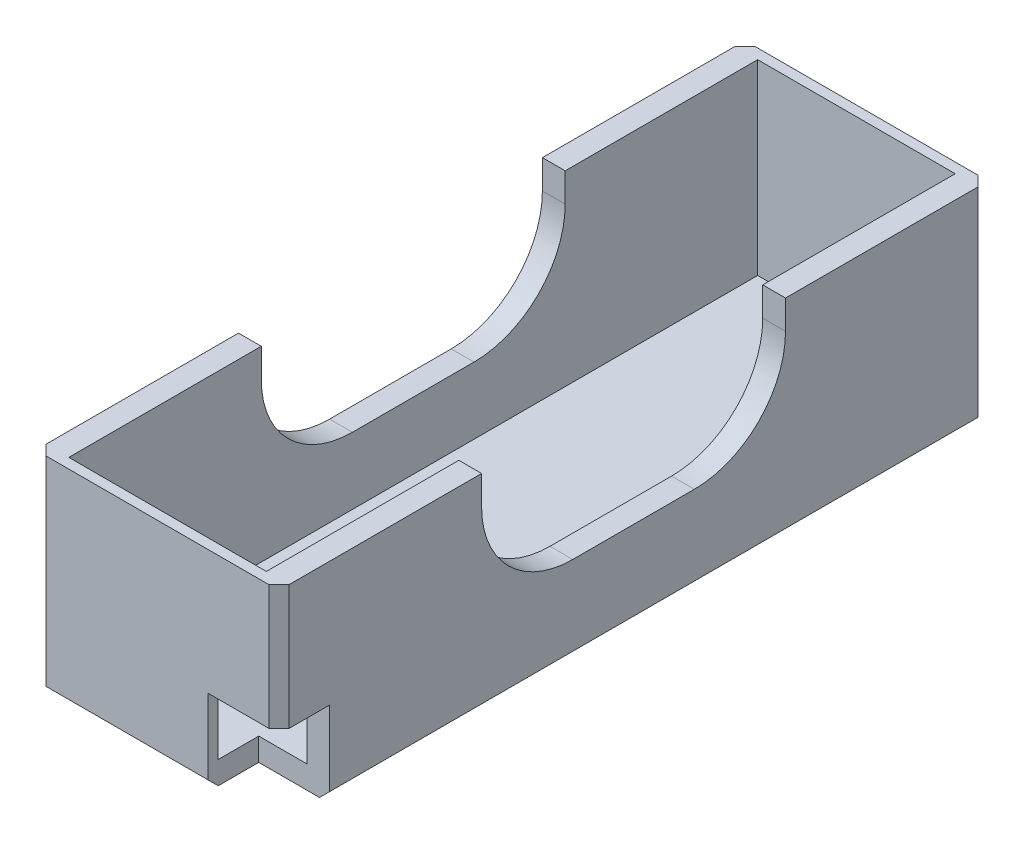
ISO-10303-21;
HEADER;
FILE_DESCRIPTION(('STEP AP214'),'2;1');
FILE_NAME('part.step','',(''),(''),'','','');
FILE_SCHEMA(('AUTOMOTIVE_DESIGN { 1 0 10303 214 1 1 1 1 }'));
ENDSEC;
DATA;
#1=APPLICATION_CONTEXT('core data for automotive mechanical design processes');
#2=APPLICATION_PROTOCOL_DEFINITION('international standard','automotive_design',2000,#1);
#3=PRODUCT_CONTEXT('',#1,'mechanical');
#4=PRODUCT('Part','Part','',(#3));
#5=PRODUCT_RELATED_PRODUCT_CATEGORY('part','',(#4));
#6=PRODUCT_DEFINITION_FORMATION('','',#4);
#7=PRODUCT_DEFINITION_CONTEXT('part definition',#1,'design');
#8=PRODUCT_DEFINITION('design','',#6,#7);
#9=PRODUCT_DEFINITION_SHAPE('','',#8);
#10=(LENGTH_UNIT() NAMED_UNIT(*) SI_UNIT(.MILLI.,.METRE.));
#11=(NAMED_UNIT(*) PLANE_ANGLE_UNIT() SI_UNIT($,.RADIAN.));
#12=(NAMED_UNIT(*) SI_UNIT($,.STERADIAN.) SOLID_ANGLE_UNIT());
#13=UNCERTAINTY_MEASURE_WITH_UNIT(LENGTH_MEASURE(1.E-05),#10,'distance_accuracy_value','');
#14=(GEOMETRIC_REPRESENTATION_CONTEXT(3) GLOBAL_UNCERTAINTY_ASSIGNED_CONTEXT((#13)) GLOBAL_UNIT_ASSIGNED_CONTEXT((#10,
#11,#12)) REPRESENTATION_CONTEXT('',''));
#15=CARTESIAN_POINT('',(0.,0.,0.));
#16=DIRECTION('',(0.,0.,1.));
#17=DIRECTION('',(1.,0.,0.));
#18=AXIS2_PLACEMENT_3D('',#15,#16,#17);
#19=CARTESIAN_POINT('',(0.,20.7,0.));
#20=DIRECTION('',(0.,1.,0.));
#21=DIRECTION('',(0.,0.,1.));
#22=AXIS2_PLACEMENT_3D('',#19,#20,#21);
#23=PLANE('',#22);
#24=DIRECTION('',(0.,0.,-1.));
#25=VECTOR('',#24,1.);
#26=CARTESIAN_POINT('',(12.,20.7,35.));
#27=LINE('',#26,#25);
#28=CARTESIAN_POINT('',(12.,20.7,-15.));
#29=VERTEX_POINT('',#28);
#30=CARTESIAN_POINT('',(12.,20.7,-34.));
#31=VERTEX_POINT('',#30);
#32=EDGE_CURVE('E354',#29,#31,#27,.T.);
#33=ORIENTED_EDGE('',*,*,#32,.T.);
#34=DIRECTION('',(0.707106781186545,0.,0.70710678118655));
#35=VECTOR('',#34,1.);
#36=CARTESIAN_POINT('',(23.,20.7,-22.9999999999999));
#37=LINE('',#36,#35);
#38=CARTESIAN_POINT('',(11.,20.7,-35.));
#39=VERTEX_POINT('',#38);
#40=EDGE_CURVE('E446',#31,#39,#37,.F.);
#41=ORIENTED_EDGE('',*,*,#40,.T.);
#42=DIRECTION('',(-1.,0.,0.));
#43=VECTOR('',#42,1.);
#44=CARTESIAN_POINT('',(12.,20.7,-35.));
#45=LINE('',#44,#43);
#46=CARTESIAN_POINT('',(-11.,20.7,-35.));
#47=VERTEX_POINT('',#46);
#48=EDGE_CURVE('E357',#39,#47,#45,.T.);
#49=ORIENTED_EDGE('',*,*,#48,.T.);
#50=DIRECTION('',(0.707106781186545,0.,-0.70710678118655));
#51=VECTOR('',#50,1.);
#52=CARTESIAN_POINT('',(-23.,20.7,-22.9999999999999));
#53=LINE('',#52,#51);
#54=CARTESIAN_POINT('',(-12.,20.7,-34.));
#55=VERTEX_POINT('',#54);
#56=EDGE_CURVE('E444',#47,#55,#53,.F.);
#57=ORIENTED_EDGE('',*,*,#56,.T.);
#58=DIRECTION('',(0.,0.,1.));
#59=VECTOR('',#58,1.);
#60=CARTESIAN_POINT('',(-12.,20.7,35.));
#61=LINE('',#60,#59);
#62=CARTESIAN_POINT('',(-12.,20.7,-15.));
#63=VERTEX_POINT('',#62);
#64=EDGE_CURVE('E349',#55,#63,#61,.T.);
#65=ORIENTED_EDGE('',*,*,#64,.T.);
#66=DIRECTION('',(-1.,0.,0.));
#67=VECTOR('',#66,1.);
#68=CARTESIAN_POINT('',(12.,20.7,-15.));
#69=LINE('',#68,#67);
#70=CARTESIAN_POINT('',(-9.75,20.7,-15.));
#71=VERTEX_POINT('',#70);
#72=EDGE_CURVE('E295',#71,#63,#69,.T.);
#73=ORIENTED_EDGE('',*,*,#72,.F.);
#74=DIRECTION('',(0.,0.,1.));
#75=VECTOR('',#74,1.);
#76=CARTESIAN_POINT('',(-9.75,20.7,34.));
#77=LINE('',#76,#75);
#78=CARTESIAN_POINT('',(-9.75,20.7,-34.));
#79=VERTEX_POINT('',#78);
#80=EDGE_CURVE('E325',#79,#71,#77,.T.);
#81=ORIENTED_EDGE('',*,*,#80,.F.);
#82=DIRECTION('',(-1.,0.,0.));
#83=VECTOR('',#82,1.);
#84=CARTESIAN_POINT('',(9.75,20.7,-34.));
#85=LINE('',#84,#83);
#86=CARTESIAN_POINT('',(9.75,20.7,-34.));
#87=VERTEX_POINT('',#86);
#88=EDGE_CURVE('E335',#87,#79,#85,.T.);
#89=ORIENTED_EDGE('',*,*,#88,.F.);
#90=DIRECTION('',(0.,0.,-1.));
#91=VECTOR('',#90,1.);
#92=CARTESIAN_POINT('',(9.75,20.7,34.));
#93=LINE('',#92,#91);
#94=CARTESIAN_POINT('',(9.75,20.7,-15.));
#95=VERTEX_POINT('',#94);
#96=EDGE_CURVE('E331',#95,#87,#93,.T.);
#97=ORIENTED_EDGE('',*,*,#96,.F.);
#98=EDGE_CURVE('E291',#29,#95,#69,.T.);
#99=ORIENTED_EDGE('',*,*,#98,.F.);
#100=EDGE_LOOP('',(#33,#41,#49,#57,#65,#73,#81,#89,#97,#99));
#101=FACE_BOUND('',#100,.T.);
#102=ADVANCED_FACE('F35',(#101),#23,.T.);
#103=CARTESIAN_POINT('',(-12.,20.7,35.));
#104=DIRECTION('',(1.,0.,0.));
#105=DIRECTION('',(0.,0.,-1.));
#106=AXIS2_PLACEMENT_3D('',#103,#104,#105);
#107=PLANE('',#106);
#108=ORIENTED_EDGE('',*,*,#64,.F.);
#109=DIRECTION('',(0.,-1.,0.));
#110=VECTOR('',#109,1.);
#111=CARTESIAN_POINT('',(-12.,20.7,-34.));
#112=LINE('',#111,#110);
#113=CARTESIAN_POINT('',(-12.,0.999999999999994,-34.));
#114=VERTEX_POINT('',#113);
#115=EDGE_CURVE('E44',#55,#114,#112,.T.);
#116=ORIENTED_EDGE('',*,*,#115,.T.);
#117=DIRECTION('',(0.,0.,1.));
#118=VECTOR('',#117,1.);
#119=CARTESIAN_POINT('',(-12.,0.999999999999994,35.));
#120=LINE('',#119,#118);
#121=CARTESIAN_POINT('',(-12.,0.999999999999994,34.));
#122=VERTEX_POINT('',#121);
#123=EDGE_CURVE('E55',#114,#122,#120,.T.);
#124=ORIENTED_EDGE('',*,*,#123,.T.);
#125=DIRECTION('',(0.,1.,0.));
#126=VECTOR('',#125,1.);
#127=CARTESIAN_POINT('',(-12.,20.7,34.));
#128=LINE('',#127,#126);
#129=CARTESIAN_POINT('',(-12.,20.7,34.));
#130=VERTEX_POINT('',#129);
#131=EDGE_CURVE('E448',#122,#130,#128,.T.);
#132=ORIENTED_EDGE('',*,*,#131,.T.);
#133=CARTESIAN_POINT('',(-12.,20.7,15.));
#134=VERTEX_POINT('',#133);
#135=EDGE_CURVE('E348',#134,#130,#61,.T.);
#136=ORIENTED_EDGE('',*,*,#135,.F.);
#137=DIRECTION('',(0.,-1.,0.));
#138=VECTOR('',#137,1.);
#139=CARTESIAN_POINT('',(-12.,20.7,15.));
#140=LINE('',#139,#138);
#141=CARTESIAN_POINT('',(-12.,17.85,15.));
#142=VERTEX_POINT('',#141);
#143=EDGE_CURVE('E306',#134,#142,#140,.T.);
#144=ORIENTED_EDGE('',*,*,#143,.T.);
#145=CARTESIAN_POINT('',(-12.,17.85,6.));
#146=DIRECTION('',(1.,0.,0.));
#147=DIRECTION('',(0.,0.,-1.));
#148=AXIS2_PLACEMENT_3D('',#145,#146,#147);
#149=CIRCLE('',#148,9.);
#150=CARTESIAN_POINT('',(-12.,8.85,6.00000000000001));
#151=VERTEX_POINT('',#150);
#152=EDGE_CURVE('E388',#142,#151,#149,.T.);
#153=ORIENTED_EDGE('',*,*,#152,.T.);
#154=DIRECTION('',(0.,0.,-1.));
#155=VECTOR('',#154,1.);
#156=CARTESIAN_POINT('',(-12.,8.85,35.));
#157=LINE('',#156,#155);
#158=CARTESIAN_POINT('',(-12.,8.85,-6.00000000000001));
#159=VERTEX_POINT('',#158);
#160=EDGE_CURVE('E301',#151,#159,#157,.T.);
#161=ORIENTED_EDGE('',*,*,#160,.T.);
#162=CARTESIAN_POINT('',(-12.,17.85,-6.));
#163=DIRECTION('',(1.,0.,0.));
#164=DIRECTION('',(0.,0.,-1.));
#165=AXIS2_PLACEMENT_3D('',#162,#163,#164);
#166=CIRCLE('',#165,9.);
#167=CARTESIAN_POINT('',(-12.,17.85,-15.));
#168=VERTEX_POINT('',#167);
#169=EDGE_CURVE('E396',#159,#168,#166,.T.);
#170=ORIENTED_EDGE('',*,*,#169,.T.);
#171=DIRECTION('',(0.,1.,0.));
#172=VECTOR('',#171,1.);
#173=CARTESIAN_POINT('',(-12.,20.7,-15.));
#174=LINE('',#173,#172);
#175=EDGE_CURVE('E312',#168,#63,#174,.T.);
#176=ORIENTED_EDGE('',*,*,#175,.T.);
#177=EDGE_LOOP('',(#108,#116,#124,#132,#136,#144,#153,#161,#170,#176));
#178=FACE_BOUND('',#177,.T.);
#179=ADVANCED_FACE('F557',(#178),#107,.F.);
#180=CARTESIAN_POINT('',(12.,20.7,35.));
#181=DIRECTION('',(0.,0.,-1.));
#182=DIRECTION('',(-1.,0.,0.));
#183=AXIS2_PLACEMENT_3D('',#180,#181,#182);
#184=PLANE('',#183);
#185=DIRECTION('',(-1.,0.,0.));
#186=VECTOR('',#185,1.);
#187=CARTESIAN_POINT('',(12.,8.41,35.));
#188=LINE('',#187,#186);
#189=CARTESIAN_POINT('',(11.,8.41,35.));
#190=VERTEX_POINT('',#189);
#191=CARTESIAN_POINT('',(5.,8.41,35.));
#192=VERTEX_POINT('',#191);
#193=EDGE_CURVE('E480',#190,#192,#188,.T.);
#194=ORIENTED_EDGE('',*,*,#193,.F.);
#195=DIRECTION('',(0.,1.,0.));
#196=VECTOR('',#195,1.);
#197=CARTESIAN_POINT('',(11.,20.7,35.));
#198=LINE('',#197,#196);
#199=CARTESIAN_POINT('',(11.,20.7,35.));
#200=VERTEX_POINT('',#199);
#201=EDGE_CURVE('E423',#190,#200,#198,.T.);
#202=ORIENTED_EDGE('',*,*,#201,.T.);
#203=DIRECTION('',(1.,0.,0.));
#204=VECTOR('',#203,1.);
#205=CARTESIAN_POINT('',(12.,20.7,35.));
#206=LINE('',#205,#204);
#207=CARTESIAN_POINT('',(-11.,20.7,35.));
#208=VERTEX_POINT('',#207);
#209=EDGE_CURVE('E351',#208,#200,#206,.T.);
#210=ORIENTED_EDGE('',*,*,#209,.F.);
#211=DIRECTION('',(0.,-1.,0.));
#212=VECTOR('',#211,1.);
#213=CARTESIAN_POINT('',(-11.,20.7,35.));
#214=LINE('',#213,#212);
#215=CARTESIAN_POINT('',(-11.,0.999999999999994,35.));
#216=VERTEX_POINT('',#215);
#217=EDGE_CURVE('E419',#208,#216,#214,.T.);
#218=ORIENTED_EDGE('',*,*,#217,.T.);
#219=DIRECTION('',(1.,0.,0.));
#220=VECTOR('',#219,1.);
#221=CARTESIAN_POINT('',(12.,0.999999999999994,35.));
#222=LINE('',#221,#220);
#223=CARTESIAN_POINT('',(5.,0.999999999999994,35.));
#224=VERTEX_POINT('',#223);
#225=EDGE_CURVE('E421',#216,#224,#222,.T.);
#226=ORIENTED_EDGE('',*,*,#225,.T.);
#227=DIRECTION('',(0.,-1.,0.));
#228=VECTOR('',#227,1.);
#229=CARTESIAN_POINT('',(5.,0.,35.));
#230=LINE('',#229,#228);
#231=EDGE_CURVE('E477',#192,#224,#230,.T.);
#232=ORIENTED_EDGE('',*,*,#231,.F.);
#233=EDGE_LOOP('',(#194,#202,#210,#218,#226,#232));
#234=FACE_BOUND('',#233,.T.);
#235=ADVANCED_FACE('F547',(#234),#184,.F.);
#236=CARTESIAN_POINT('',(12.,20.7,35.));
#237=DIRECTION('',(-1.,0.,0.));
#238=DIRECTION('',(0.,0.,1.));
#239=AXIS2_PLACEMENT_3D('',#236,#237,#238);
#240=PLANE('',#239);
#241=CARTESIAN_POINT('',(12.,20.7,34.));
#242=VERTEX_POINT('',#241);
#243=CARTESIAN_POINT('',(12.,20.7,15.));
#244=VERTEX_POINT('',#243);
#245=EDGE_CURVE('E355',#242,#244,#27,.T.);
#246=ORIENTED_EDGE('',*,*,#245,.F.);
#247=DIRECTION('',(0.,-1.,0.));
#248=VECTOR('',#247,1.);
#249=CARTESIAN_POINT('',(12.,20.7,34.));
#250=LINE('',#249,#248);
#251=CARTESIAN_POINT('',(12.,8.41,34.));
#252=VERTEX_POINT('',#251);
#253=EDGE_CURVE('E266',#242,#252,#250,.T.);
#254=ORIENTED_EDGE('',*,*,#253,.T.);
#255=DIRECTION('',(0.,0.,1.));
#256=VECTOR('',#255,1.);
#257=CARTESIAN_POINT('',(12.,8.41,30.));
#258=LINE('',#257,#256);
#259=CARTESIAN_POINT('',(12.,8.41,30.));
#260=VERTEX_POINT('',#259);
#261=EDGE_CURVE('E257',#260,#252,#258,.T.);
#262=ORIENTED_EDGE('',*,*,#261,.F.);
#263=DIRECTION('',(0.,1.,0.));
#264=VECTOR('',#263,1.);
#265=CARTESIAN_POINT('',(12.,0.,30.));
#266=LINE('',#265,#264);
#267=CARTESIAN_POINT('',(12.,0.999999999999994,30.));
#268=VERTEX_POINT('',#267);
#269=EDGE_CURVE('E240',#268,#260,#266,.T.);
#270=ORIENTED_EDGE('',*,*,#269,.F.);
#271=DIRECTION('',(0.,0.,-1.));
#272=VECTOR('',#271,1.);
#273=CARTESIAN_POINT('',(12.,0.999999999999994,35.));
#274=LINE('',#273,#272);
#275=CARTESIAN_POINT('',(12.,0.999999999999994,-34.));
#276=VERTEX_POINT('',#275);
#277=EDGE_CURVE('E414',#268,#276,#274,.T.);
#278=ORIENTED_EDGE('',*,*,#277,.T.);
#279=DIRECTION('',(0.,1.,0.));
#280=VECTOR('',#279,1.);
#281=CARTESIAN_POINT('',(12.,20.7,-34.));
#282=LINE('',#281,#280);
#283=EDGE_CURVE('E412',#276,#31,#282,.T.);
#284=ORIENTED_EDGE('',*,*,#283,.T.);
#285=ORIENTED_EDGE('',*,*,#32,.F.);
#286=DIRECTION('',(0.,-1.,0.));
#287=VECTOR('',#286,1.);
#288=CARTESIAN_POINT('',(12.,8.85,-15.));
#289=LINE('',#288,#287);
#290=CARTESIAN_POINT('',(12.,17.85,-15.));
#291=VERTEX_POINT('',#290);
#292=EDGE_CURVE('E281',#29,#291,#289,.T.);
#293=ORIENTED_EDGE('',*,*,#292,.T.);
#294=CARTESIAN_POINT('',(12.,17.85,-6.));
#295=DIRECTION('',(-1.,0.,0.));
#296=DIRECTION('',(0.,0.,1.));
#297=AXIS2_PLACEMENT_3D('',#294,#295,#296);
#298=CIRCLE('',#297,9.);
#299=CARTESIAN_POINT('',(12.,8.85,-6.));
#300=VERTEX_POINT('',#299);
#301=EDGE_CURVE('E402',#291,#300,#298,.T.);
#302=ORIENTED_EDGE('',*,*,#301,.T.);
#303=DIRECTION('',(0.,0.,1.));
#304=VECTOR('',#303,1.);
#305=CARTESIAN_POINT('',(12.,8.85,15.));
#306=LINE('',#305,#304);
#307=CARTESIAN_POINT('',(12.,8.85,6.00000000000001));
#308=VERTEX_POINT('',#307);
#309=EDGE_CURVE('E284',#300,#308,#306,.T.);
#310=ORIENTED_EDGE('',*,*,#309,.T.);
#311=CARTESIAN_POINT('',(12.,17.85,6.));
#312=DIRECTION('',(-1.,0.,0.));
#313=DIRECTION('',(0.,0.,1.));
#314=AXIS2_PLACEMENT_3D('',#311,#312,#313);
#315=CIRCLE('',#314,9.);
#316=CARTESIAN_POINT('',(12.,17.85,15.));
#317=VERTEX_POINT('',#316);
#318=EDGE_CURVE('E394',#308,#317,#315,.T.);
#319=ORIENTED_EDGE('',*,*,#318,.T.);
#320=DIRECTION('',(0.,1.,0.));
#321=VECTOR('',#320,1.);
#322=CARTESIAN_POINT('',(12.,8.85,15.));
#323=LINE('',#322,#321);
#324=EDGE_CURVE('E287',#317,#244,#323,.T.);
#325=ORIENTED_EDGE('',*,*,#324,.T.);
#326=EDGE_LOOP('',(#246,#254,#262,#270,#278,#284,#285,#293,#302,#310,#319,#325));
#327=FACE_BOUND('',#326,.T.);
#328=ADVANCED_FACE('F264',(#327),#240,.F.);
#329=CARTESIAN_POINT('',(12.,20.7,-35.));
#330=DIRECTION('',(0.,0.,1.));
#331=DIRECTION('',(1.,0.,0.));
#332=AXIS2_PLACEMENT_3D('',#329,#330,#331);
#333=PLANE('',#332);
#334=ORIENTED_EDGE('',*,*,#48,.F.);
#335=DIRECTION('',(0.,-1.,0.));
#336=VECTOR('',#335,1.);
#337=CARTESIAN_POINT('',(11.,20.7,-35.));
#338=LINE('',#337,#336);
#339=CARTESIAN_POINT('',(11.,0.999999999999994,-35.));
#340=VERTEX_POINT('',#339);
#341=EDGE_CURVE('E442',#39,#340,#338,.T.);
#342=ORIENTED_EDGE('',*,*,#341,.T.);
#343=DIRECTION('',(-1.,0.,0.));
#344=VECTOR('',#343,1.);
#345=CARTESIAN_POINT('',(12.,0.999999999999994,-35.));
#346=LINE('',#345,#344);
#347=CARTESIAN_POINT('',(-11.,0.999999999999994,-35.));
#348=VERTEX_POINT('',#347);
#349=EDGE_CURVE('E440',#340,#348,#346,.T.);
#350=ORIENTED_EDGE('',*,*,#349,.T.);
#351=DIRECTION('',(0.,1.,0.));
#352=VECTOR('',#351,1.);
#353=CARTESIAN_POINT('',(-11.,20.7,-35.));
#354=LINE('',#353,#352);
#355=EDGE_CURVE('E438',#348,#47,#354,.T.);
#356=ORIENTED_EDGE('',*,*,#355,.T.);
#357=EDGE_LOOP('',(#334,#342,#350,#356));
#358=FACE_BOUND('',#357,.T.);
#359=ADVANCED_FACE('F621',(#358),#333,.F.);
#360=ORIENTED_EDGE('',*,*,#209,.T.);
#361=DIRECTION('',(-0.707106781186552,0.,0.707106781186543));
#362=VECTOR('',#361,1.);
#363=CARTESIAN_POINT('',(22.9999999999999,20.7,23.0000000000002));
#364=LINE('',#363,#362);
#365=EDGE_CURVE('E427',#200,#242,#364,.F.);
#366=ORIENTED_EDGE('',*,*,#365,.T.);
#367=ORIENTED_EDGE('',*,*,#245,.T.);
#368=DIRECTION('',(-1.,0.,0.));
#369=VECTOR('',#368,1.);
#370=CARTESIAN_POINT('',(12.,20.7,15.));
#371=LINE('',#370,#369);
#372=CARTESIAN_POINT('',(9.75,20.7,15.));
#373=VERTEX_POINT('',#372);
#374=EDGE_CURVE('E296',#244,#373,#371,.T.);
#375=ORIENTED_EDGE('',*,*,#374,.T.);
#376=CARTESIAN_POINT('',(9.75,20.7,34.));
#377=VERTEX_POINT('',#376);
#378=EDGE_CURVE('E332',#377,#373,#93,.T.);
#379=ORIENTED_EDGE('',*,*,#378,.F.);
#380=DIRECTION('',(1.,0.,0.));
#381=VECTOR('',#380,1.);
#382=CARTESIAN_POINT('',(9.75,20.7,34.));
#383=LINE('',#382,#381);
#384=CARTESIAN_POINT('',(-9.75,20.7,34.));
#385=VERTEX_POINT('',#384);
#386=EDGE_CURVE('E328',#385,#377,#383,.T.);
#387=ORIENTED_EDGE('',*,*,#386,.F.);
#388=CARTESIAN_POINT('',(-9.75,20.7,15.));
#389=VERTEX_POINT('',#388);
#390=EDGE_CURVE('E315',#389,#385,#77,.T.);
#391=ORIENTED_EDGE('',*,*,#390,.F.);
#392=EDGE_CURVE('E290',#389,#134,#371,.T.);
#393=ORIENTED_EDGE('',*,*,#392,.T.);
#394=ORIENTED_EDGE('',*,*,#135,.T.);
#395=DIRECTION('',(-0.707106781186548,0.,-0.707106781186548));
#396=VECTOR('',#395,1.);
#397=CARTESIAN_POINT('',(-23.,20.7,23.));
#398=LINE('',#397,#396);
#399=EDGE_CURVE('E425',#130,#208,#398,.F.);
#400=ORIENTED_EDGE('',*,*,#399,.T.);
#401=EDGE_LOOP('',(#360,#366,#367,#375,#379,#387,#391,#393,#394,#400));
#402=FACE_BOUND('',#401,.T.);
#403=ADVANCED_FACE('F559',(#402),#23,.T.);
#404=CARTESIAN_POINT('',(0.,0.,0.));
#405=DIRECTION('',(0.,1.,0.));
#406=DIRECTION('',(0.,0.,1.));
#407=AXIS2_PLACEMENT_3D('',#404,#405,#406);
#408=PLANE('',#407);
#409=DIRECTION('',(1.,0.,0.));
#410=VECTOR('',#409,1.);
#411=CARTESIAN_POINT('',(0.,0.,-34.));
#412=LINE('',#411,#410);
#413=CARTESIAN_POINT('',(-11.,0.,-34.));
#414=VERTEX_POINT('',#413);
#415=CARTESIAN_POINT('',(11.,0.,-34.));
#416=VERTEX_POINT('',#415);
#417=EDGE_CURVE('E433',#414,#416,#412,.T.);
#418=ORIENTED_EDGE('',*,*,#417,.T.);
#419=DIRECTION('',(0.,0.,1.));
#420=VECTOR('',#419,1.);
#421=CARTESIAN_POINT('',(11.,0.,0.));
#422=LINE('',#421,#420);
#423=CARTESIAN_POINT('',(11.,0.,30.));
#424=VERTEX_POINT('',#423);
#425=EDGE_CURVE('E435',#416,#424,#422,.T.);
#426=ORIENTED_EDGE('',*,*,#425,.T.);
#427=DIRECTION('',(1.,0.,0.));
#428=VECTOR('',#427,1.);
#429=CARTESIAN_POINT('',(12.,0.,30.));
#430=LINE('',#429,#428);
#431=CARTESIAN_POINT('',(5.,0.,30.));
#432=VERTEX_POINT('',#431);
#433=EDGE_CURVE('E252',#432,#424,#430,.T.);
#434=ORIENTED_EDGE('',*,*,#433,.F.);
#435=DIRECTION('',(0.,0.,1.));
#436=VECTOR('',#435,1.);
#437=CARTESIAN_POINT('',(5.,0.,30.));
#438=LINE('',#437,#436);
#439=CARTESIAN_POINT('',(5.,0.,34.));
#440=VERTEX_POINT('',#439);
#441=EDGE_CURVE('E260',#432,#440,#438,.T.);
#442=ORIENTED_EDGE('',*,*,#441,.T.);
#443=DIRECTION('',(-1.,0.,0.));
#444=VECTOR('',#443,1.);
#445=CARTESIAN_POINT('',(0.,0.,34.));
#446=LINE('',#445,#444);
#447=CARTESIAN_POINT('',(-11.,0.,34.));
#448=VERTEX_POINT('',#447);
#449=EDGE_CURVE('E429',#440,#448,#446,.T.);
#450=ORIENTED_EDGE('',*,*,#449,.T.);
#451=DIRECTION('',(0.,0.,-1.));
#452=VECTOR('',#451,1.);
#453=CARTESIAN_POINT('',(-11.,0.,0.));
#454=LINE('',#453,#452);
#455=EDGE_CURVE('E431',#448,#414,#454,.T.);
#456=ORIENTED_EDGE('',*,*,#455,.T.);
#457=EDGE_LOOP('',(#418,#426,#434,#442,#450,#456));
#458=FACE_BOUND('',#457,.T.);
#459=ADVANCED_FACE('F493',(#458),#408,.F.);
#460=CARTESIAN_POINT('',(-9.75,-70.7407237735097,34.));
#461=DIRECTION('',(-1.,0.,0.));
#462=DIRECTION('',(0.,0.,1.));
#463=AXIS2_PLACEMENT_3D('',#460,#461,#462);
#464=PLANE('',#463);
#465=ORIENTED_EDGE('',*,*,#80,.T.);
#466=DIRECTION('',(0.,-1.,0.));
#467=VECTOR('',#466,1.);
#468=CARTESIAN_POINT('',(-9.75,-70.7407237735097,-15.));
#469=LINE('',#468,#467);
#470=CARTESIAN_POINT('',(-9.75,17.85,-15.));
#471=VERTEX_POINT('',#470);
#472=EDGE_CURVE('E309',#71,#471,#469,.T.);
#473=ORIENTED_EDGE('',*,*,#472,.T.);
#474=CARTESIAN_POINT('',(-9.75,17.85,-6.));
#475=DIRECTION('',(-1.,0.,0.));
#476=DIRECTION('',(0.,0.,1.));
#477=AXIS2_PLACEMENT_3D('',#474,#475,#476);
#478=CIRCLE('',#477,9.);
#479=CARTESIAN_POINT('',(-9.75,8.84999999999999,-6.00000000000001));
#480=VERTEX_POINT('',#479);
#481=EDGE_CURVE('E398',#471,#480,#478,.T.);
#482=ORIENTED_EDGE('',*,*,#481,.T.);
#483=DIRECTION('',(0.,0.,1.));
#484=VECTOR('',#483,1.);
#485=CARTESIAN_POINT('',(-9.75,8.85,34.));
#486=LINE('',#485,#484);
#487=CARTESIAN_POINT('',(-9.75,8.84999999999999,6.00000000000001));
#488=VERTEX_POINT('',#487);
#489=EDGE_CURVE('E294',#480,#488,#486,.T.);
#490=ORIENTED_EDGE('',*,*,#489,.T.);
#491=CARTESIAN_POINT('',(-9.75,17.85,6.));
#492=DIRECTION('',(-1.,0.,0.));
#493=DIRECTION('',(0.,0.,1.));
#494=AXIS2_PLACEMENT_3D('',#491,#492,#493);
#495=CIRCLE('',#494,9.);
#496=CARTESIAN_POINT('',(-9.75,17.85,15.));
#497=VERTEX_POINT('',#496);
#498=EDGE_CURVE('E390',#488,#497,#495,.T.);
#499=ORIENTED_EDGE('',*,*,#498,.T.);
#500=DIRECTION('',(0.,1.,0.));
#501=VECTOR('',#500,1.);
#502=CARTESIAN_POINT('',(-9.75,-70.7407237735097,15.));
#503=LINE('',#502,#501);
#504=EDGE_CURVE('E304',#497,#389,#503,.T.);
#505=ORIENTED_EDGE('',*,*,#504,.T.);
#506=ORIENTED_EDGE('',*,*,#390,.T.);
#507=DIRECTION('',(0.,1.,0.));
#508=VECTOR('',#507,1.);
#509=CARTESIAN_POINT('',(-9.75,-70.7407237735097,34.));
#510=LINE('',#509,#508);
#511=CARTESIAN_POINT('',(-9.75,2.25,34.));
#512=VERTEX_POINT('',#511);
#513=EDGE_CURVE('E338',#512,#385,#510,.T.);
#514=ORIENTED_EDGE('',*,*,#513,.F.);
#515=DIRECTION('',(0.,0.,-1.));
#516=VECTOR('',#515,1.);
#517=CARTESIAN_POINT('',(-9.75,2.25,34.));
#518=LINE('',#517,#516);
#519=CARTESIAN_POINT('',(-9.75,2.25,-34.));
#520=VERTEX_POINT('',#519);
#521=EDGE_CURVE('E322',#512,#520,#518,.T.);
#522=ORIENTED_EDGE('',*,*,#521,.T.);
#523=DIRECTION('',(0.,1.,0.));
#524=VECTOR('',#523,1.);
#525=CARTESIAN_POINT('',(-9.75,-70.7407237735097,-34.));
#526=LINE('',#525,#524);
#527=EDGE_CURVE('E320',#520,#79,#526,.T.);
#528=ORIENTED_EDGE('',*,*,#527,.T.);
#529=EDGE_LOOP('',(#465,#473,#482,#490,#499,#505,#506,#514,#522,#528));
#530=FACE_BOUND('',#529,.T.);
#531=ADVANCED_FACE('F577',(#530),#464,.F.);
#532=CARTESIAN_POINT('',(9.75,-70.7407237735097,-34.));
#533=DIRECTION('',(0.,0.,-1.));
#534=DIRECTION('',(-1.,0.,0.));
#535=AXIS2_PLACEMENT_3D('',#532,#533,#534);
#536=PLANE('',#535);
#537=DIRECTION('',(1.,0.,0.));
#538=VECTOR('',#537,1.);
#539=CARTESIAN_POINT('',(9.75,2.25,-34.));
#540=LINE('',#539,#538);
#541=CARTESIAN_POINT('',(9.75,2.25,-34.));
#542=VERTEX_POINT('',#541);
#543=EDGE_CURVE('E319',#520,#542,#540,.T.);
#544=ORIENTED_EDGE('',*,*,#543,.T.);
#545=DIRECTION('',(0.,1.,0.));
#546=VECTOR('',#545,1.);
#547=CARTESIAN_POINT('',(9.75,-70.7407237735097,-34.));
#548=LINE('',#547,#546);
#549=EDGE_CURVE('E340',#542,#87,#548,.T.);
#550=ORIENTED_EDGE('',*,*,#549,.T.);
#551=ORIENTED_EDGE('',*,*,#88,.T.);
#552=ORIENTED_EDGE('',*,*,#527,.F.);
#553=EDGE_LOOP('',(#544,#550,#551,#552));
#554=FACE_BOUND('',#553,.T.);
#555=ADVANCED_FACE('F593',(#554),#536,.F.);
#556=CARTESIAN_POINT('',(9.75,-70.7407237735097,34.));
#557=DIRECTION('',(1.,0.,0.));
#558=DIRECTION('',(0.,0.,-1.));
#559=AXIS2_PLACEMENT_3D('',#556,#557,#558);
#560=PLANE('',#559);
#561=DIRECTION('',(0.,-1.,0.));
#562=VECTOR('',#561,1.);
#563=CARTESIAN_POINT('',(9.75,-70.7407237735097,30.));
#564=LINE('',#563,#562);
#565=CARTESIAN_POINT('',(9.75,8.41,30.));
#566=VERTEX_POINT('',#565);
#567=CARTESIAN_POINT('',(9.75,2.25,30.));
#568=VERTEX_POINT('',#567);
#569=EDGE_CURVE('E270',#566,#568,#564,.T.);
#570=ORIENTED_EDGE('',*,*,#569,.F.);
#571=DIRECTION('',(0.,0.,1.));
#572=VECTOR('',#571,1.);
#573=CARTESIAN_POINT('',(9.75,8.41,34.));
#574=LINE('',#573,#572);
#575=CARTESIAN_POINT('',(9.75,8.41,34.));
#576=VERTEX_POINT('',#575);
#577=EDGE_CURVE('E259',#566,#576,#574,.T.);
#578=ORIENTED_EDGE('',*,*,#577,.T.);
#579=DIRECTION('',(0.,1.,0.));
#580=VECTOR('',#579,1.);
#581=CARTESIAN_POINT('',(9.75,-70.7407237735097,34.));
#582=LINE('',#581,#580);
#583=EDGE_CURVE('E343',#576,#377,#582,.T.);
#584=ORIENTED_EDGE('',*,*,#583,.T.);
#585=ORIENTED_EDGE('',*,*,#378,.T.);
#586=DIRECTION('',(0.,-1.,0.));
#587=VECTOR('',#586,1.);
#588=CARTESIAN_POINT('',(9.75,-70.7407237735097,15.));
#589=LINE('',#588,#587);
#590=CARTESIAN_POINT('',(9.75,17.85,15.));
#591=VERTEX_POINT('',#590);
#592=EDGE_CURVE('E363',#373,#591,#589,.T.);
#593=ORIENTED_EDGE('',*,*,#592,.T.);
#594=CARTESIAN_POINT('',(9.75,17.85,6.));
#595=DIRECTION('',(1.,0.,0.));
#596=DIRECTION('',(0.,0.,-1.));
#597=AXIS2_PLACEMENT_3D('',#594,#595,#596);
#598=CIRCLE('',#597,9.);
#599=CARTESIAN_POINT('',(9.75,8.84999999999999,6.00000000000001));
#600=VERTEX_POINT('',#599);
#601=EDGE_CURVE('E392',#591,#600,#598,.T.);
#602=ORIENTED_EDGE('',*,*,#601,.T.);
#603=DIRECTION('',(0.,0.,-1.));
#604=VECTOR('',#603,1.);
#605=CARTESIAN_POINT('',(9.75,8.85,34.));
#606=LINE('',#605,#604);
#607=CARTESIAN_POINT('',(9.75,8.84999999999999,-6.00000000000001));
#608=VERTEX_POINT('',#607);
#609=EDGE_CURVE('E360',#600,#608,#606,.T.);
#610=ORIENTED_EDGE('',*,*,#609,.T.);
#611=CARTESIAN_POINT('',(9.75,17.85,-6.));
#612=DIRECTION('',(1.,0.,0.));
#613=DIRECTION('',(0.,0.,-1.));
#614=AXIS2_PLACEMENT_3D('',#611,#612,#613);
#615=CIRCLE('',#614,9.);
#616=CARTESIAN_POINT('',(9.75,17.85,-15.));
#617=VERTEX_POINT('',#616);
#618=EDGE_CURVE('E400',#608,#617,#615,.T.);
#619=ORIENTED_EDGE('',*,*,#618,.T.);
#620=DIRECTION('',(0.,1.,0.));
#621=VECTOR('',#620,1.);
#622=CARTESIAN_POINT('',(9.75,-70.7407237735097,-15.));
#623=LINE('',#622,#621);
#624=EDGE_CURVE('E366',#617,#95,#623,.T.);
#625=ORIENTED_EDGE('',*,*,#624,.T.);
#626=ORIENTED_EDGE('',*,*,#96,.T.);
#627=ORIENTED_EDGE('',*,*,#549,.F.);
#628=DIRECTION('',(0.,0.,1.));
#629=VECTOR('',#628,1.);
#630=CARTESIAN_POINT('',(9.75,2.25,34.));
#631=LINE('',#630,#629);
#632=EDGE_CURVE('E316',#542,#568,#631,.T.);
#633=ORIENTED_EDGE('',*,*,#632,.T.);
#634=EDGE_LOOP('',(#570,#578,#584,#585,#593,#602,#610,#619,#625,#626,#627,#633));
#635=FACE_BOUND('',#634,.T.);
#636=ADVANCED_FACE('F530',(#635),#560,.F.);
#637=CARTESIAN_POINT('',(9.75,-70.7407237735097,34.));
#638=DIRECTION('',(0.,0.,1.));
#639=DIRECTION('',(1.,0.,0.));
#640=AXIS2_PLACEMENT_3D('',#637,#638,#639);
#641=PLANE('',#640);
#642=DIRECTION('',(-1.,0.,0.));
#643=VECTOR('',#642,1.);
#644=CARTESIAN_POINT('',(9.75,8.41,34.));
#645=LINE('',#644,#643);
#646=CARTESIAN_POINT('',(5.,8.41,34.));
#647=VERTEX_POINT('',#646);
#648=EDGE_CURVE('E409',#576,#647,#645,.T.);
#649=ORIENTED_EDGE('',*,*,#648,.T.);
#650=DIRECTION('',(0.,-1.,0.));
#651=VECTOR('',#650,1.);
#652=CARTESIAN_POINT('',(5.,-70.7407237735097,34.));
#653=LINE('',#652,#651);
#654=CARTESIAN_POINT('',(5.,2.25,34.));
#655=VERTEX_POINT('',#654);
#656=EDGE_CURVE('E277',#647,#655,#653,.T.);
#657=ORIENTED_EDGE('',*,*,#656,.T.);
#658=DIRECTION('',(-1.,0.,0.));
#659=VECTOR('',#658,1.);
#660=CARTESIAN_POINT('',(9.75,2.25,34.));
#661=LINE('',#660,#659);
#662=EDGE_CURVE('E324',#655,#512,#661,.T.);
#663=ORIENTED_EDGE('',*,*,#662,.T.);
#664=ORIENTED_EDGE('',*,*,#513,.T.);
#665=ORIENTED_EDGE('',*,*,#386,.T.);
#666=ORIENTED_EDGE('',*,*,#583,.F.);
#667=EDGE_LOOP('',(#649,#657,#663,#664,#665,#666));
#668=FACE_BOUND('',#667,.T.);
#669=ADVANCED_FACE('F601',(#668),#641,.F.);
#670=CARTESIAN_POINT('',(0.,2.25,0.));
#671=DIRECTION('',(0.,1.,0.));
#672=DIRECTION('',(0.,0.,1.));
#673=AXIS2_PLACEMENT_3D('',#670,#671,#672);
#674=PLANE('',#673);
#675=DIRECTION('',(0.,0.,1.));
#676=VECTOR('',#675,1.);
#677=CARTESIAN_POINT('',(5.,2.25,0.));
#678=LINE('',#677,#676);
#679=CARTESIAN_POINT('',(5.,2.25,30.));
#680=VERTEX_POINT('',#679);
#681=EDGE_CURVE('E407',#680,#655,#678,.T.);
#682=ORIENTED_EDGE('',*,*,#681,.F.);
#683=DIRECTION('',(1.,0.,0.));
#684=VECTOR('',#683,1.);
#685=CARTESIAN_POINT('',(0.,2.25,30.));
#686=LINE('',#685,#684);
#687=EDGE_CURVE('E404',#680,#568,#686,.T.);
#688=ORIENTED_EDGE('',*,*,#687,.T.);
#689=ORIENTED_EDGE('',*,*,#632,.F.);
#690=ORIENTED_EDGE('',*,*,#543,.F.);
#691=ORIENTED_EDGE('',*,*,#521,.F.);
#692=ORIENTED_EDGE('',*,*,#662,.F.);
#693=EDGE_LOOP('',(#682,#688,#689,#690,#691,#692));
#694=FACE_BOUND('',#693,.T.);
#695=ADVANCED_FACE('F597',(#694),#674,.T.);
#696=CARTESIAN_POINT('',(12.,8.85,15.));
#697=DIRECTION('',(0.,-1.,0.));
#698=DIRECTION('',(0.,0.,-1.));
#699=AXIS2_PLACEMENT_3D('',#696,#697,#698);
#700=PLANE('',#699);
#701=ORIENTED_EDGE('',*,*,#609,.F.);
#702=DIRECTION('',(-1.,0.,0.));
#703=VECTOR('',#702,1.);
#704=CARTESIAN_POINT('',(12.,8.85,6.));
#705=LINE('',#704,#703);
#706=EDGE_CURVE('E382',#600,#308,#705,.F.);
#707=ORIENTED_EDGE('',*,*,#706,.T.);
#708=ORIENTED_EDGE('',*,*,#309,.F.);
#709=DIRECTION('',(-1.,0.,0.));
#710=VECTOR('',#709,1.);
#711=CARTESIAN_POINT('',(9.75,8.85,-6.));
#712=LINE('',#711,#710);
#713=EDGE_CURVE('E379',#300,#608,#712,.T.);
#714=ORIENTED_EDGE('',*,*,#713,.T.);
#715=EDGE_LOOP('',(#701,#707,#708,#714));
#716=FACE_BOUND('',#715,.T.);
#717=ADVANCED_FACE('F527',(#716),#700,.F.);
#718=CARTESIAN_POINT('',(12.,8.85,15.));
#719=DIRECTION('',(0.,0.,1.));
#720=DIRECTION('',(1.,0.,0.));
#721=AXIS2_PLACEMENT_3D('',#718,#719,#720);
#722=PLANE('',#721);
#723=ORIENTED_EDGE('',*,*,#324,.F.);
#724=DIRECTION('',(-1.,0.,0.));
#725=VECTOR('',#724,1.);
#726=CARTESIAN_POINT('',(9.75,17.85,15.));
#727=LINE('',#726,#725);
#728=EDGE_CURVE('E376',#317,#591,#727,.T.);
#729=ORIENTED_EDGE('',*,*,#728,.T.);
#730=ORIENTED_EDGE('',*,*,#592,.F.);
#731=ORIENTED_EDGE('',*,*,#374,.F.);
#732=EDGE_LOOP('',(#723,#729,#730,#731));
#733=FACE_BOUND('',#732,.T.);
#734=ADVANCED_FACE('F537',(#733),#722,.F.);
#735=CARTESIAN_POINT('',(12.,8.85,-15.));
#736=DIRECTION('',(0.,0.,-1.));
#737=DIRECTION('',(0.,1.,0.));
#738=AXIS2_PLACEMENT_3D('',#735,#736,#737);
#739=PLANE('',#738);
#740=ORIENTED_EDGE('',*,*,#624,.F.);
#741=DIRECTION('',(-1.,0.,0.));
#742=VECTOR('',#741,1.);
#743=CARTESIAN_POINT('',(12.,17.85,-15.));
#744=LINE('',#743,#742);
#745=EDGE_CURVE('E386',#617,#291,#744,.F.);
#746=ORIENTED_EDGE('',*,*,#745,.T.);
#747=ORIENTED_EDGE('',*,*,#292,.F.);
#748=ORIENTED_EDGE('',*,*,#98,.T.);
#749=EDGE_LOOP('',(#740,#746,#747,#748));
#750=FACE_BOUND('',#749,.T.);
#751=ADVANCED_FACE('F518',(#750),#739,.F.);
#752=ORIENTED_EDGE('',*,*,#175,.F.);
#753=DIRECTION('',(-1.,0.,0.));
#754=VECTOR('',#753,1.);
#755=CARTESIAN_POINT('',(-9.75,17.85,-15.));
#756=LINE('',#755,#754);
#757=EDGE_CURVE('E384',#168,#471,#756,.F.);
#758=ORIENTED_EDGE('',*,*,#757,.T.);
#759=ORIENTED_EDGE('',*,*,#472,.F.);
#760=ORIENTED_EDGE('',*,*,#72,.T.);
#761=EDGE_LOOP('',(#752,#758,#759,#760));
#762=FACE_BOUND('',#761,.T.);
#763=ADVANCED_FACE('F585',(#762),#739,.F.);
#764=ORIENTED_EDGE('',*,*,#504,.F.);
#765=DIRECTION('',(-1.,0.,0.));
#766=VECTOR('',#765,1.);
#767=CARTESIAN_POINT('',(-12.,17.85,15.));
#768=LINE('',#767,#766);
#769=EDGE_CURVE('E368',#497,#142,#768,.T.);
#770=ORIENTED_EDGE('',*,*,#769,.T.);
#771=ORIENTED_EDGE('',*,*,#143,.F.);
#772=ORIENTED_EDGE('',*,*,#392,.F.);
#773=EDGE_LOOP('',(#764,#770,#771,#772));
#774=FACE_BOUND('',#773,.T.);
#775=ADVANCED_FACE('F565',(#774),#722,.F.);
#776=ORIENTED_EDGE('',*,*,#160,.F.);
#777=DIRECTION('',(-1.,0.,0.));
#778=VECTOR('',#777,1.);
#779=CARTESIAN_POINT('',(-9.75,8.85,6.));
#780=LINE('',#779,#778);
#781=EDGE_CURVE('E374',#151,#488,#780,.F.);
#782=ORIENTED_EDGE('',*,*,#781,.T.);
#783=ORIENTED_EDGE('',*,*,#489,.F.);
#784=DIRECTION('',(-1.,0.,0.));
#785=VECTOR('',#784,1.);
#786=CARTESIAN_POINT('',(-12.,8.85,-6.));
#787=LINE('',#786,#785);
#788=EDGE_CURVE('E371',#480,#159,#787,.T.);
#789=ORIENTED_EDGE('',*,*,#788,.T.);
#790=EDGE_LOOP('',(#776,#782,#783,#789));
#791=FACE_BOUND('',#790,.T.);
#792=ADVANCED_FACE('F571',(#791),#700,.F.);
#793=CARTESIAN_POINT('',(12.,17.85,6.));
#794=DIRECTION('',(1.,0.,0.));
#795=DIRECTION('',(0.,0.,-1.));
#796=AXIS2_PLACEMENT_3D('',#793,#794,#795);
#797=CYLINDRICAL_SURFACE('',#796,9.);
#798=ORIENTED_EDGE('',*,*,#498,.F.);
#799=ORIENTED_EDGE('',*,*,#781,.F.);
#800=ORIENTED_EDGE('',*,*,#152,.F.);
#801=ORIENTED_EDGE('',*,*,#769,.F.);
#802=EDGE_LOOP('',(#798,#799,#800,#801));
#803=FACE_BOUND('',#802,.T.);
#804=ADVANCED_FACE('F575',(#803),#797,.F.);
#805=CARTESIAN_POINT('',(12.,17.85,6.));
#806=DIRECTION('',(1.,0.,0.));
#807=DIRECTION('',(0.,0.,-1.));
#808=AXIS2_PLACEMENT_3D('',#805,#806,#807);
#809=CYLINDRICAL_SURFACE('',#808,9.);
#810=ORIENTED_EDGE('',*,*,#318,.F.);
#811=ORIENTED_EDGE('',*,*,#706,.F.);
#812=ORIENTED_EDGE('',*,*,#601,.F.);
#813=ORIENTED_EDGE('',*,*,#728,.F.);
#814=EDGE_LOOP('',(#810,#811,#812,#813));
#815=FACE_BOUND('',#814,.T.);
#816=ADVANCED_FACE('F534',(#815),#809,.F.);
#817=CARTESIAN_POINT('',(12.,17.85,-6.));
#818=DIRECTION('',(1.,0.,0.));
#819=DIRECTION('',(0.,0.,-1.));
#820=AXIS2_PLACEMENT_3D('',#817,#818,#819);
#821=CYLINDRICAL_SURFACE('',#820,9.);
#822=ORIENTED_EDGE('',*,*,#481,.F.);
#823=ORIENTED_EDGE('',*,*,#757,.F.);
#824=ORIENTED_EDGE('',*,*,#169,.F.);
#825=ORIENTED_EDGE('',*,*,#788,.F.);
#826=EDGE_LOOP('',(#822,#823,#824,#825));
#827=FACE_BOUND('',#826,.T.);
#828=ADVANCED_FACE('F580',(#827),#821,.F.);
#829=CARTESIAN_POINT('',(12.,17.85,-6.));
#830=DIRECTION('',(1.,0.,0.));
#831=DIRECTION('',(0.,0.,-1.));
#832=AXIS2_PLACEMENT_3D('',#829,#830,#831);
#833=CYLINDRICAL_SURFACE('',#832,9.);
#834=ORIENTED_EDGE('',*,*,#301,.F.);
#835=ORIENTED_EDGE('',*,*,#745,.F.);
#836=ORIENTED_EDGE('',*,*,#618,.F.);
#837=ORIENTED_EDGE('',*,*,#713,.F.);
#838=EDGE_LOOP('',(#834,#835,#836,#837));
#839=FACE_BOUND('',#838,.T.);
#840=ADVANCED_FACE('F524',(#839),#833,.F.);
#841=CARTESIAN_POINT('',(12.,8.41,30.));
#842=DIRECTION('',(0.,1.,0.));
#843=DIRECTION('',(0.,0.,1.));
#844=AXIS2_PLACEMENT_3D('',#841,#842,#843);
#845=PLANE('',#844);
#846=ORIENTED_EDGE('',*,*,#261,.T.);
#847=DIRECTION('',(0.707106781186552,0.,-0.707106781186543));
#848=VECTOR('',#847,1.);
#849=CARTESIAN_POINT('',(12.,8.41,34.));
#850=LINE('',#849,#848);
#851=EDGE_CURVE('E417',#252,#190,#850,.F.);
#852=ORIENTED_EDGE('',*,*,#851,.T.);
#853=ORIENTED_EDGE('',*,*,#193,.T.);
#854=DIRECTION('',(0.,0.,1.));
#855=VECTOR('',#854,1.);
#856=CARTESIAN_POINT('',(5.,8.41,30.));
#857=LINE('',#856,#855);
#858=EDGE_CURVE('E267',#647,#192,#857,.T.);
#859=ORIENTED_EDGE('',*,*,#858,.F.);
#860=ORIENTED_EDGE('',*,*,#648,.F.);
#861=ORIENTED_EDGE('',*,*,#577,.F.);
#862=DIRECTION('',(-1.,0.,0.));
#863=VECTOR('',#862,1.);
#864=CARTESIAN_POINT('',(12.,8.41,30.));
#865=LINE('',#864,#863);
#866=EDGE_CURVE('E244',#260,#566,#865,.T.);
#867=ORIENTED_EDGE('',*,*,#866,.F.);
#868=EDGE_LOOP('',(#846,#852,#853,#859,#860,#861,#867));
#869=FACE_BOUND('',#868,.T.);
#870=ADVANCED_FACE('F256',(#869),#845,.F.);
#871=CARTESIAN_POINT('',(5.,0.,30.));
#872=DIRECTION('',(-1.,0.,0.));
#873=DIRECTION('',(0.,0.,1.));
#874=AXIS2_PLACEMENT_3D('',#871,#872,#873);
#875=PLANE('',#874);
#876=ORIENTED_EDGE('',*,*,#231,.T.);
#877=DIRECTION('',(0.,0.707106781186548,0.707106781186548));
#878=VECTOR('',#877,1.);
#879=CARTESIAN_POINT('',(5.,0.999999999999994,35.));
#880=LINE('',#879,#878);
#881=EDGE_CURVE('E12',#224,#440,#880,.F.);
#882=ORIENTED_EDGE('',*,*,#881,.T.);
#883=ORIENTED_EDGE('',*,*,#441,.F.);
#884=DIRECTION('',(0.,-1.,0.));
#885=VECTOR('',#884,1.);
#886=CARTESIAN_POINT('',(5.,0.,30.));
#887=LINE('',#886,#885);
#888=EDGE_CURVE('E485',#680,#432,#887,.T.);
#889=ORIENTED_EDGE('',*,*,#888,.F.);
#890=ORIENTED_EDGE('',*,*,#681,.T.);
#891=ORIENTED_EDGE('',*,*,#656,.F.);
#892=ORIENTED_EDGE('',*,*,#858,.T.);
#893=EDGE_LOOP('',(#876,#882,#883,#889,#890,#891,#892));
#894=FACE_BOUND('',#893,.T.);
#895=ADVANCED_FACE('F599',(#894),#875,.F.);
#896=CARTESIAN_POINT('',(0.,0.,30.));
#897=DIRECTION('',(0.,0.,1.));
#898=DIRECTION('',(1.,0.,0.));
#899=AXIS2_PLACEMENT_3D('',#896,#897,#898);
#900=PLANE('',#899);
#901=ORIENTED_EDGE('',*,*,#433,.T.);
#902=DIRECTION('',(-0.707106781186548,-0.707106781186548,0.));
#903=VECTOR('',#902,1.);
#904=CARTESIAN_POINT('',(5.5,-5.5,30.));
#905=LINE('',#904,#903);
#906=EDGE_CURVE('E247',#424,#268,#905,.F.);
#907=ORIENTED_EDGE('',*,*,#906,.T.);
#908=ORIENTED_EDGE('',*,*,#269,.T.);
#909=ORIENTED_EDGE('',*,*,#866,.T.);
#910=ORIENTED_EDGE('',*,*,#569,.T.);
#911=ORIENTED_EDGE('',*,*,#687,.F.);
#912=ORIENTED_EDGE('',*,*,#888,.T.);
#913=EDGE_LOOP('',(#901,#907,#908,#909,#910,#911,#912));
#914=FACE_BOUND('',#913,.T.);
#915=ADVANCED_FACE('F243',(#914),#900,.T.);
#916=CARTESIAN_POINT('',(12.,20.7,34.));
#917=DIRECTION('',(-0.707106781186543,0.,-0.707106781186552));
#918=DIRECTION('',(0.,-1.,0.));
#919=AXIS2_PLACEMENT_3D('',#916,#917,#918);
#920=PLANE('',#919);
#921=ORIENTED_EDGE('',*,*,#365,.F.);
#922=ORIENTED_EDGE('',*,*,#201,.F.);
#923=ORIENTED_EDGE('',*,*,#851,.F.);
#924=ORIENTED_EDGE('',*,*,#253,.F.);
#925=EDGE_LOOP('',(#921,#922,#923,#924));
#926=FACE_BOUND('',#925,.T.);
#927=ADVANCED_FACE('F542',(#926),#920,.F.);
#928=CARTESIAN_POINT('',(-11.,20.7,35.));
#929=DIRECTION('',(0.707106781186547,0.,-0.707106781186547));
#930=DIRECTION('',(0.,-1.,0.));
#931=AXIS2_PLACEMENT_3D('',#928,#929,#930);
#932=PLANE('',#931);
#933=ORIENTED_EDGE('',*,*,#399,.F.);
#934=ORIENTED_EDGE('',*,*,#131,.F.);
#935=DIRECTION('',(0.707106781186547,0.,0.707106781186547));
#936=VECTOR('',#935,1.);
#937=CARTESIAN_POINT('',(-12.,0.999999999999994,34.));
#938=LINE('',#937,#936);
#939=EDGE_CURVE('E39',#216,#122,#938,.F.);
#940=ORIENTED_EDGE('',*,*,#939,.F.);
#941=ORIENTED_EDGE('',*,*,#217,.F.);
#942=EDGE_LOOP('',(#933,#934,#940,#941));
#943=FACE_BOUND('',#942,.T.);
#944=ADVANCED_FACE('F37',(#943),#932,.F.);
#945=CARTESIAN_POINT('',(12.,0.999999999999994,35.));
#946=DIRECTION('',(0.,0.707106781186547,-0.707106781186547));
#947=DIRECTION('',(1.,0.,0.));
#948=AXIS2_PLACEMENT_3D('',#945,#946,#947);
#949=PLANE('',#948);
#950=ORIENTED_EDGE('',*,*,#881,.F.);
#951=ORIENTED_EDGE('',*,*,#225,.F.);
#952=DIRECTION('',(0.,-0.707106781186547,-0.707106781186547));
#953=VECTOR('',#952,1.);
#954=CARTESIAN_POINT('',(-11.,0.499999999999997,34.5));
#955=LINE('',#954,#953);
#956=EDGE_CURVE('E471',#448,#216,#955,.F.);
#957=ORIENTED_EDGE('',*,*,#956,.F.);
#958=ORIENTED_EDGE('',*,*,#449,.F.);
#959=EDGE_LOOP('',(#950,#951,#957,#958));
#960=FACE_BOUND('',#959,.T.);
#961=ADVANCED_FACE('F552',(#960),#949,.F.);
#962=CARTESIAN_POINT('',(-12.,0.999999999999994,34.));
#963=DIRECTION('',(-0.577350269189626,-0.577350269189626,0.577350269189626));
#964=DIRECTION('',(0.707106781186547,0.,0.707106781186547));
#965=AXIS2_PLACEMENT_3D('',#962,#963,#964);
#966=PLANE('',#965);
#967=ORIENTED_EDGE('',*,*,#956,.T.);
#968=ORIENTED_EDGE('',*,*,#939,.T.);
#969=DIRECTION('',(-0.707106781186547,0.707106781186547,0.));
#970=VECTOR('',#969,1.);
#971=CARTESIAN_POINT('',(-12.,0.999999999999994,34.));
#972=LINE('',#971,#970);
#973=EDGE_CURVE('E469',#448,#122,#972,.T.);
#974=ORIENTED_EDGE('',*,*,#973,.F.);
#975=EDGE_LOOP('',(#967,#968,#974));
#976=FACE_BOUND('',#975,.T.);
#977=ADVANCED_FACE('F666',(#976),#966,.T.);
#978=CARTESIAN_POINT('',(-12.,20.7,-34.));
#979=DIRECTION('',(0.70710678118655,0.,0.707106781186545));
#980=DIRECTION('',(0.,-1.,0.));
#981=AXIS2_PLACEMENT_3D('',#978,#979,#980);
#982=PLANE('',#981);
#983=ORIENTED_EDGE('',*,*,#56,.F.);
#984=ORIENTED_EDGE('',*,*,#355,.F.);
#985=DIRECTION('',(-0.707106781186545,0.,0.70710678118655));
#986=VECTOR('',#985,1.);
#987=CARTESIAN_POINT('',(-11.,0.999999999999994,-35.));
#988=LINE('',#987,#986);
#989=EDGE_CURVE('E466',#114,#348,#988,.F.);
#990=ORIENTED_EDGE('',*,*,#989,.F.);
#991=ORIENTED_EDGE('',*,*,#115,.F.);
#992=EDGE_LOOP('',(#983,#984,#990,#991));
#993=FACE_BOUND('',#992,.T.);
#994=ADVANCED_FACE('F662',(#993),#982,.F.);
#995=CARTESIAN_POINT('',(-12.,0.999999999999994,35.));
#996=DIRECTION('',(0.707106781186547,0.707106781186547,0.));
#997=DIRECTION('',(0.,0.,1.));
#998=AXIS2_PLACEMENT_3D('',#995,#996,#997);
#999=PLANE('',#998);
#1000=ORIENTED_EDGE('',*,*,#973,.T.);
#1001=ORIENTED_EDGE('',*,*,#123,.F.);
#1002=DIRECTION('',(0.707106781186547,-0.707106781186547,0.));
#1003=VECTOR('',#1002,1.);
#1004=CARTESIAN_POINT('',(-11.5,0.499999999999994,-34.));
#1005=LINE('',#1004,#1003);
#1006=EDGE_CURVE('E463',#414,#114,#1005,.F.);
#1007=ORIENTED_EDGE('',*,*,#1006,.F.);
#1008=ORIENTED_EDGE('',*,*,#455,.F.);
#1009=EDGE_LOOP('',(#1000,#1001,#1007,#1008));
#1010=FACE_BOUND('',#1009,.T.);
#1011=ADVANCED_FACE('F658',(#1010),#999,.F.);
#1012=CARTESIAN_POINT('',(-11.,0.999999999999994,-35.));
#1013=DIRECTION('',(-0.577350269189628,-0.577350269189624,-0.577350269189624));
#1014=DIRECTION('',(-0.707106781186545,0.,0.70710678118655));
#1015=AXIS2_PLACEMENT_3D('',#1012,#1013,#1014);
#1016=PLANE('',#1015);
#1017=ORIENTED_EDGE('',*,*,#1006,.T.);
#1018=ORIENTED_EDGE('',*,*,#989,.T.);
#1019=DIRECTION('',(0.,0.707106781186547,-0.707106781186547));
#1020=VECTOR('',#1019,1.);
#1021=CARTESIAN_POINT('',(-11.,0.999999999999994,-35.));
#1022=LINE('',#1021,#1020);
#1023=EDGE_CURVE('E460',#414,#348,#1022,.T.);
#1024=ORIENTED_EDGE('',*,*,#1023,.F.);
#1025=EDGE_LOOP('',(#1017,#1018,#1024));
#1026=FACE_BOUND('',#1025,.T.);
#1027=ADVANCED_FACE('F655',(#1026),#1016,.T.);
#1028=CARTESIAN_POINT('',(11.,20.7,-35.));
#1029=DIRECTION('',(-0.70710678118655,0.,0.707106781186545));
#1030=DIRECTION('',(0.,-1.,0.));
#1031=AXIS2_PLACEMENT_3D('',#1028,#1029,#1030);
#1032=PLANE('',#1031);
#1033=ORIENTED_EDGE('',*,*,#40,.F.);
#1034=ORIENTED_EDGE('',*,*,#283,.F.);
#1035=DIRECTION('',(-0.707106781186545,0.,-0.70710678118655));
#1036=VECTOR('',#1035,1.);
#1037=CARTESIAN_POINT('',(12.,0.999999999999994,-34.));
#1038=LINE('',#1037,#1036);
#1039=EDGE_CURVE('E457',#340,#276,#1038,.F.);
#1040=ORIENTED_EDGE('',*,*,#1039,.F.);
#1041=ORIENTED_EDGE('',*,*,#341,.F.);
#1042=EDGE_LOOP('',(#1033,#1034,#1040,#1041));
#1043=FACE_BOUND('',#1042,.T.);
#1044=ADVANCED_FACE('F508',(#1043),#1032,.F.);
#1045=CARTESIAN_POINT('',(12.,0.999999999999994,-35.));
#1046=DIRECTION('',(0.,0.707106781186547,0.707106781186547));
#1047=DIRECTION('',(-1.,0.,0.));
#1048=AXIS2_PLACEMENT_3D('',#1045,#1046,#1047);
#1049=PLANE('',#1048);
#1050=ORIENTED_EDGE('',*,*,#1023,.T.);
#1051=ORIENTED_EDGE('',*,*,#349,.F.);
#1052=DIRECTION('',(0.,-0.707106781186547,0.707106781186547));
#1053=VECTOR('',#1052,1.);
#1054=CARTESIAN_POINT('',(11.,0.499999999999994,-34.5));
#1055=LINE('',#1054,#1053);
#1056=EDGE_CURVE('E454',#416,#340,#1055,.F.);
#1057=ORIENTED_EDGE('',*,*,#1056,.F.);
#1058=ORIENTED_EDGE('',*,*,#417,.F.);
#1059=EDGE_LOOP('',(#1050,#1051,#1057,#1058));
#1060=FACE_BOUND('',#1059,.T.);
#1061=ADVANCED_FACE('F649',(#1060),#1049,.F.);
#1062=CARTESIAN_POINT('',(12.,0.999999999999994,-34.));
#1063=DIRECTION('',(0.577350269189628,-0.577350269189624,-0.577350269189624));
#1064=DIRECTION('',(-0.707106781186545,0.,-0.70710678118655));
#1065=AXIS2_PLACEMENT_3D('',#1062,#1063,#1064);
#1066=PLANE('',#1065);
#1067=ORIENTED_EDGE('',*,*,#1056,.T.);
#1068=ORIENTED_EDGE('',*,*,#1039,.T.);
#1069=DIRECTION('',(0.707106781186547,0.707106781186547,0.));
#1070=VECTOR('',#1069,1.);
#1071=CARTESIAN_POINT('',(12.,0.999999999999994,-34.));
#1072=LINE('',#1071,#1070);
#1073=EDGE_CURVE('E452',#416,#276,#1072,.T.);
#1074=ORIENTED_EDGE('',*,*,#1073,.F.);
#1075=EDGE_LOOP('',(#1067,#1068,#1074));
#1076=FACE_BOUND('',#1075,.T.);
#1077=ADVANCED_FACE('F502',(#1076),#1066,.T.);
#1078=CARTESIAN_POINT('',(12.,0.999999999999994,35.));
#1079=DIRECTION('',(-0.707106781186547,0.707106781186547,0.));
#1080=DIRECTION('',(0.,0.,-1.));
#1081=AXIS2_PLACEMENT_3D('',#1078,#1079,#1080);
#1082=PLANE('',#1081);
#1083=ORIENTED_EDGE('',*,*,#906,.F.);
#1084=ORIENTED_EDGE('',*,*,#425,.F.);
#1085=ORIENTED_EDGE('',*,*,#1073,.T.);
#1086=ORIENTED_EDGE('',*,*,#277,.F.);
#1087=EDGE_LOOP('',(#1083,#1084,#1085,#1086));
#1088=FACE_BOUND('',#1087,.T.);
#1089=ADVANCED_FACE('F500',(#1088),#1082,.F.);
#1090=CLOSED_SHELL('',(#102,#179,#235,#328,#359,#403,#459,#531,#555,#636,#669,#695,#717,#734,
#751,#763,#775,#792,#804,#816,#828,#840,#870,#895,#915,#927,#944,#961,#977,#994,#1011,#1027,
#1044,#1061,#1077,#1089));
#1091=MANIFOLD_SOLID_BREP('B2',#1090);
#1092=ADVANCED_BREP_SHAPE_REPRESENTATION('',(#18,#1091),#14);
#1093=SHAPE_DEFINITION_REPRESENTATION(#9,#1092);
ENDSEC;
END-ISO-10303-21;
